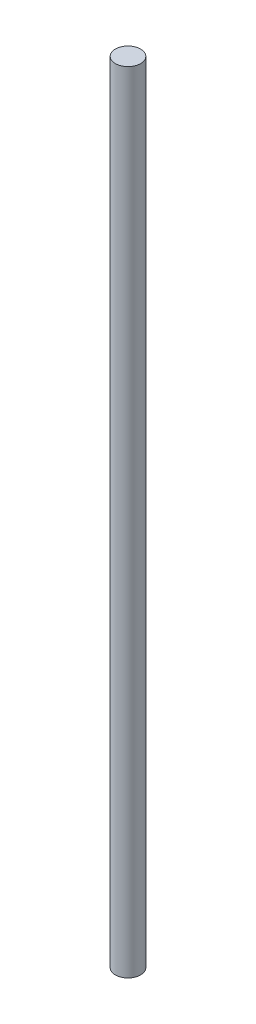
ISO-10303-21;
HEADER;
FILE_DESCRIPTION(('STEP AP214'),'2;1');
FILE_NAME('part.step','',(''),(''),'','','');
FILE_SCHEMA(('AUTOMOTIVE_DESIGN { 1 0 10303 214 1 1 1 1 }'));
ENDSEC;
DATA;
#1=APPLICATION_CONTEXT('core data for automotive mechanical design processes');
#2=APPLICATION_PROTOCOL_DEFINITION('international standard','automotive_design',2000,#1);
#3=PRODUCT_CONTEXT('',#1,'mechanical');
#4=PRODUCT('Part','Part','',(#3));
#5=PRODUCT_RELATED_PRODUCT_CATEGORY('part','',(#4));
#6=PRODUCT_DEFINITION_FORMATION('','',#4);
#7=PRODUCT_DEFINITION_CONTEXT('part definition',#1,'design');
#8=PRODUCT_DEFINITION('design','',#6,#7);
#9=PRODUCT_DEFINITION_SHAPE('','',#8);
#10=(LENGTH_UNIT() NAMED_UNIT(*) SI_UNIT(.MILLI.,.METRE.));
#11=(NAMED_UNIT(*) PLANE_ANGLE_UNIT() SI_UNIT($,.RADIAN.));
#12=(NAMED_UNIT(*) SI_UNIT($,.STERADIAN.) SOLID_ANGLE_UNIT());
#13=UNCERTAINTY_MEASURE_WITH_UNIT(LENGTH_MEASURE(1.E-05),#10,'distance_accuracy_value','');
#14=(GEOMETRIC_REPRESENTATION_CONTEXT(3) GLOBAL_UNCERTAINTY_ASSIGNED_CONTEXT((#13)) GLOBAL_UNIT_ASSIGNED_CONTEXT((#10,
#11,#12)) REPRESENTATION_CONTEXT('',''));
#15=CARTESIAN_POINT('',(0.,0.,0.));
#16=DIRECTION('',(0.,0.,1.));
#17=DIRECTION('',(1.,0.,0.));
#18=AXIS2_PLACEMENT_3D('',#15,#16,#17);
#19=CARTESIAN_POINT('',(0.,198.57,0.));
#20=DIRECTION('',(0.,-1.,0.));
#21=DIRECTION('',(0.,0.,-1.));
#22=AXIS2_PLACEMENT_3D('',#19,#20,#21);
#23=CYLINDRICAL_SURFACE('',#22,3.175);
#24=CARTESIAN_POINT('',(0.,198.57,0.));
#25=DIRECTION('',(0.,1.,0.));
#26=DIRECTION('',(0.,0.,1.));
#27=AXIS2_PLACEMENT_3D('',#24,#25,#26);
#28=CIRCLE('',#27,3.175);
#29=CARTESIAN_POINT('',(0.,198.57,3.175));
#30=VERTEX_POINT('',#29);
#31=EDGE_CURVE('E10',#30,#30,#28,.T.);
#32=ORIENTED_EDGE('',*,*,#31,.F.);
#33=EDGE_LOOP('',(#32));
#34=FACE_BOUND('',#33,.T.);
#35=CARTESIAN_POINT('',(0.,0.,0.));
#36=DIRECTION('',(0.,1.,0.));
#37=DIRECTION('',(0.,0.,1.));
#38=AXIS2_PLACEMENT_3D('',#35,#36,#37);
#39=CIRCLE('',#38,3.175);
#40=CARTESIAN_POINT('',(0.,0.,3.175));
#41=VERTEX_POINT('',#40);
#42=EDGE_CURVE('E34',#41,#41,#39,.T.);
#43=ORIENTED_EDGE('',*,*,#42,.T.);
#44=EDGE_LOOP('',(#43));
#45=FACE_BOUND('',#44,.T.);
#46=ADVANCED_FACE('F31',(#34,#45),#23,.T.);
#47=CARTESIAN_POINT('',(0.,198.57,0.));
#48=DIRECTION('',(0.,1.,0.));
#49=DIRECTION('',(0.,0.,1.));
#50=AXIS2_PLACEMENT_3D('',#47,#48,#49);
#51=PLANE('',#50);
#52=ORIENTED_EDGE('',*,*,#31,.T.);
#53=EDGE_LOOP('',(#52));
#54=FACE_BOUND('',#53,.T.);
#55=ADVANCED_FACE('F46',(#54),#51,.T.);
#56=CARTESIAN_POINT('',(0.,0.,0.));
#57=DIRECTION('',(0.,1.,0.));
#58=DIRECTION('',(0.,0.,1.));
#59=AXIS2_PLACEMENT_3D('',#56,#57,#58);
#60=PLANE('',#59);
#61=ORIENTED_EDGE('',*,*,#42,.F.);
#62=EDGE_LOOP('',(#61));
#63=FACE_BOUND('',#62,.T.);
#64=ADVANCED_FACE('F44',(#63),#60,.F.);
#65=CLOSED_SHELL('',(#46,#55,#64));
#66=MANIFOLD_SOLID_BREP('B2',#65);
#67=ADVANCED_BREP_SHAPE_REPRESENTATION('',(#18,#66),#14);
#68=SHAPE_DEFINITION_REPRESENTATION(#9,#67);
ENDSEC;
END-ISO-10303-21;
